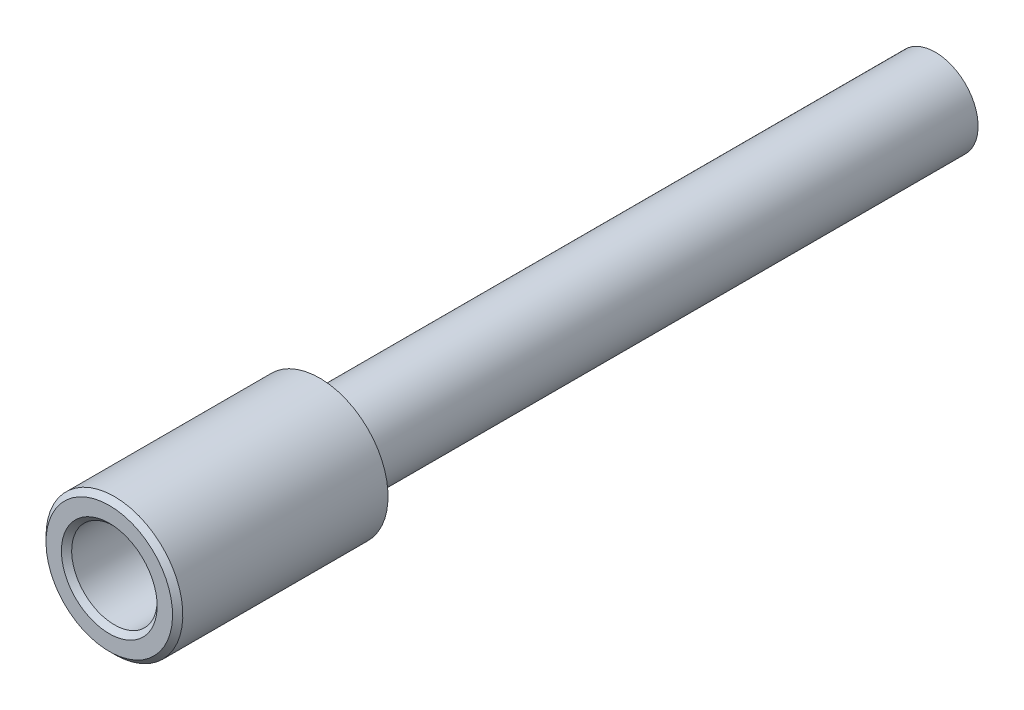
ISO-10303-21;
HEADER;
FILE_DESCRIPTION(('STEP AP214'),'2;1');
FILE_NAME('part.step','',(''),(''),'','','');
FILE_SCHEMA(('AUTOMOTIVE_DESIGN { 1 0 10303 214 1 1 1 1 }'));
ENDSEC;
DATA;
#1=APPLICATION_CONTEXT('core data for automotive mechanical design processes');
#2=APPLICATION_PROTOCOL_DEFINITION('international standard','automotive_design',2000,#1);
#3=PRODUCT_CONTEXT('',#1,'mechanical');
#4=PRODUCT('Part','Part','',(#3));
#5=PRODUCT_RELATED_PRODUCT_CATEGORY('part','',(#4));
#6=PRODUCT_DEFINITION_FORMATION('','',#4);
#7=PRODUCT_DEFINITION_CONTEXT('part definition',#1,'design');
#8=PRODUCT_DEFINITION('design','',#6,#7);
#9=PRODUCT_DEFINITION_SHAPE('','',#8);
#10=(LENGTH_UNIT() NAMED_UNIT(*) SI_UNIT(.MILLI.,.METRE.));
#11=(NAMED_UNIT(*) PLANE_ANGLE_UNIT() SI_UNIT($,.RADIAN.));
#12=(NAMED_UNIT(*) SI_UNIT($,.STERADIAN.) SOLID_ANGLE_UNIT());
#13=UNCERTAINTY_MEASURE_WITH_UNIT(LENGTH_MEASURE(1.E-05),#10,'distance_accuracy_value','');
#14=(GEOMETRIC_REPRESENTATION_CONTEXT(3) GLOBAL_UNCERTAINTY_ASSIGNED_CONTEXT((#13)) GLOBAL_UNIT_ASSIGNED_CONTEXT((#10,
#11,#12)) REPRESENTATION_CONTEXT('',''));
#15=CARTESIAN_POINT('',(0.,0.,0.));
#16=DIRECTION('',(0.,0.,1.));
#17=DIRECTION('',(1.,0.,0.));
#18=AXIS2_PLACEMENT_3D('',#15,#16,#17);
#19=CARTESIAN_POINT('',(0.,0.,0.));
#20=DIRECTION('',(0.,0.,1.));
#21=DIRECTION('',(1.,0.,0.));
#22=AXIS2_PLACEMENT_3D('',#19,#20,#21);
#23=CYLINDRICAL_SURFACE('',#22,2.5);
#24=CARTESIAN_POINT('',(0.,0.,36.));
#25=DIRECTION('',(0.,0.,1.));
#26=DIRECTION('',(1.,0.,0.));
#27=AXIS2_PLACEMENT_3D('',#24,#25,#26);
#28=CIRCLE('',#27,2.5);
#29=CARTESIAN_POINT('',(-2.5,0.,36.));
#30=VERTEX_POINT('',#29);
#31=EDGE_CURVE('E27',#30,#30,#28,.T.);
#32=ORIENTED_EDGE('',*,*,#31,.F.);
#33=DIRECTION('',(0.,0.,-1.));
#34=VECTOR('',#33,1.);
#35=CARTESIAN_POINT('',(-2.5,0.,0.));
#36=LINE('',#35,#34);
#37=CARTESIAN_POINT('',(-2.5,0.,0.));
#38=VERTEX_POINT('',#37);
#39=EDGE_CURVE('E11',#30,#38,#36,.T.);
#40=ORIENTED_EDGE('',*,*,#39,.T.);
#41=CARTESIAN_POINT('',(0.,0.,0.));
#42=DIRECTION('',(0.,0.,1.));
#43=DIRECTION('',(1.,0.,0.));
#44=AXIS2_PLACEMENT_3D('',#41,#42,#43);
#45=CIRCLE('',#44,2.5);
#46=EDGE_CURVE('E98',#38,#38,#45,.T.);
#47=ORIENTED_EDGE('',*,*,#46,.T.);
#48=ORIENTED_EDGE('',*,*,#39,.F.);
#49=EDGE_LOOP('',(#32,#40,#47,#48));
#50=FACE_BOUND('',#49,.T.);
#51=ADVANCED_FACE('F17',(#50),#23,.T.);
#52=CARTESIAN_POINT('',(0.,0.,36.));
#53=DIRECTION('',(0.,0.,1.));
#54=DIRECTION('',(1.,0.,0.));
#55=AXIS2_PLACEMENT_3D('',#52,#53,#54);
#56=PLANE('',#55);
#57=ORIENTED_EDGE('',*,*,#31,.T.);
#58=EDGE_LOOP('',(#57));
#59=FACE_BOUND('',#58,.T.);
#60=CARTESIAN_POINT('',(0.,0.,36.));
#61=DIRECTION('',(0.,0.,1.));
#62=DIRECTION('',(-1.,0.,0.));
#63=AXIS2_PLACEMENT_3D('',#60,#61,#62);
#64=CIRCLE('',#63,4.);
#65=CARTESIAN_POINT('',(-4.,0.,36.));
#66=VERTEX_POINT('',#65);
#67=EDGE_CURVE('E105',#66,#66,#64,.T.);
#68=ORIENTED_EDGE('',*,*,#67,.F.);
#69=EDGE_LOOP('',(#68));
#70=FACE_BOUND('',#69,.T.);
#71=ADVANCED_FACE('F154',(#59,#70),#56,.F.);
#72=CARTESIAN_POINT('',(0.,0.,36.));
#73=DIRECTION('',(0.,0.,1.));
#74=DIRECTION('',(1.,0.,0.));
#75=AXIS2_PLACEMENT_3D('',#72,#73,#74);
#76=CYLINDRICAL_SURFACE('',#75,4.);
#77=CARTESIAN_POINT('',(0.,0.,48.));
#78=DIRECTION('',(0.,0.,1.));
#79=DIRECTION('',(1.,0.,0.));
#80=AXIS2_PLACEMENT_3D('',#77,#78,#79);
#81=CIRCLE('',#80,4.);
#82=CARTESIAN_POINT('',(-4.,0.,48.));
#83=VERTEX_POINT('',#82);
#84=CARTESIAN_POINT('',(0.,4.0000000000005,48.));
#85=VERTEX_POINT('',#84);
#86=EDGE_CURVE('E121',#83,#85,#81,.T.);
#87=ORIENTED_EDGE('',*,*,#86,.F.);
#88=DIRECTION('',(0.,0.,-1.));
#89=VECTOR('',#88,1.);
#90=CARTESIAN_POINT('',(-4.,0.,36.));
#91=LINE('',#90,#89);
#92=EDGE_CURVE('E101',#83,#66,#91,.T.);
#93=ORIENTED_EDGE('',*,*,#92,.T.);
#94=ORIENTED_EDGE('',*,*,#67,.T.);
#95=ORIENTED_EDGE('',*,*,#92,.F.);
#96=CARTESIAN_POINT('',(0.,0.,48.));
#97=DIRECTION('',(0.,0.,1.));
#98=DIRECTION('',(1.,0.,0.));
#99=AXIS2_PLACEMENT_3D('',#96,#97,#98);
#100=CIRCLE('',#99,4.);
#101=EDGE_CURVE('E106',#85,#83,#100,.T.);
#102=ORIENTED_EDGE('',*,*,#101,.F.);
#103=EDGE_LOOP('',(#87,#93,#94,#95,#102));
#104=FACE_BOUND('',#103,.T.);
#105=ADVANCED_FACE('F151',(#104),#76,.T.);
#106=CARTESIAN_POINT('',(0.,0.,48.15000000062));
#107=DIRECTION('',(0.,0.,-1.));
#108=DIRECTION('',(0.,-1.,0.));
#109=AXIS2_PLACEMENT_3D('',#106,#107,#108);
#110=CONICAL_SURFACE('',#109,3.849999999381,0.785398163397448);
#111=ORIENTED_EDGE('',*,*,#86,.T.);
#112=DIRECTION('',(0.,-0.707106781186548,0.707106781186548));
#113=VECTOR('',#112,1.);
#114=CARTESIAN_POINT('',(0.,3.849999999381,48.15000000062));
#115=LINE('',#114,#113);
#116=CARTESIAN_POINT('',(0.,3.7000000000005,48.3));
#117=VERTEX_POINT('',#116);
#118=EDGE_CURVE('E124',#85,#117,#115,.T.);
#119=ORIENTED_EDGE('',*,*,#118,.T.);
#120=CARTESIAN_POINT('',(0.,0.,48.3));
#121=DIRECTION('',(0.,0.,1.));
#122=DIRECTION('',(1.,0.,0.));
#123=AXIS2_PLACEMENT_3D('',#120,#121,#122);
#124=CIRCLE('',#123,3.7);
#125=EDGE_CURVE('E120',#117,#117,#124,.T.);
#126=ORIENTED_EDGE('',*,*,#125,.F.);
#127=ORIENTED_EDGE('',*,*,#118,.F.);
#128=ORIENTED_EDGE('',*,*,#101,.T.);
#129=EDGE_LOOP('',(#111,#119,#126,#127,#128));
#130=FACE_BOUND('',#129,.T.);
#131=ADVANCED_FACE('F148',(#130),#110,.T.);
#132=CARTESIAN_POINT('',(0.,0.,48.3));
#133=DIRECTION('',(0.,0.,1.));
#134=DIRECTION('',(1.,0.,0.));
#135=AXIS2_PLACEMENT_3D('',#132,#133,#134);
#136=PLANE('',#135);
#137=CARTESIAN_POINT('',(0.,0.,48.3));
#138=DIRECTION('',(0.,0.,-1.));
#139=DIRECTION('',(-1.,0.,0.));
#140=AXIS2_PLACEMENT_3D('',#137,#138,#139);
#141=CIRCLE('',#140,2.8);
#142=CARTESIAN_POINT('',(0.,2.8000000000005,48.3));
#143=VERTEX_POINT('',#142);
#144=EDGE_CURVE('E117',#143,#143,#141,.T.);
#145=ORIENTED_EDGE('',*,*,#144,.T.);
#146=EDGE_LOOP('',(#145));
#147=FACE_BOUND('',#146,.T.);
#148=ORIENTED_EDGE('',*,*,#125,.T.);
#149=EDGE_LOOP('',(#148));
#150=FACE_BOUND('',#149,.T.);
#151=ADVANCED_FACE('F145',(#147,#150),#136,.T.);
#152=CARTESIAN_POINT('',(0.,0.,48.14999999688));
#153=DIRECTION('',(0.,0.,1.));
#154=DIRECTION('',(0.,-1.,0.));
#155=AXIS2_PLACEMENT_3D('',#152,#153,#154);
#156=CONICAL_SURFACE('',#155,2.649999996881,0.785398163397448);
#157=CARTESIAN_POINT('',(0.,0.,48.));
#158=DIRECTION('',(0.,0.,-1.));
#159=DIRECTION('',(-1.,0.,0.));
#160=AXIS2_PLACEMENT_3D('',#157,#158,#159);
#161=CIRCLE('',#160,2.5);
#162=CARTESIAN_POINT('',(2.5,0.,48.));
#163=VERTEX_POINT('',#162);
#164=CARTESIAN_POINT('',(0.,2.5000000000005,48.));
#165=VERTEX_POINT('',#164);
#166=EDGE_CURVE('E116',#163,#165,#161,.T.);
#167=ORIENTED_EDGE('',*,*,#166,.T.);
#168=DIRECTION('',(0.,0.707106781186548,0.707106781186548));
#169=VECTOR('',#168,1.);
#170=CARTESIAN_POINT('',(0.,2.649999996881,48.14999999688));
#171=LINE('',#170,#169);
#172=EDGE_CURVE('E20',#165,#143,#171,.T.);
#173=ORIENTED_EDGE('',*,*,#172,.T.);
#174=ORIENTED_EDGE('',*,*,#144,.F.);
#175=ORIENTED_EDGE('',*,*,#172,.F.);
#176=CARTESIAN_POINT('',(0.,0.,48.));
#177=DIRECTION('',(0.,0.,-1.));
#178=DIRECTION('',(-1.,0.,0.));
#179=AXIS2_PLACEMENT_3D('',#176,#177,#178);
#180=CIRCLE('',#179,2.5);
#181=EDGE_CURVE('E130',#165,#163,#180,.T.);
#182=ORIENTED_EDGE('',*,*,#181,.T.);
#183=EDGE_LOOP('',(#167,#173,#174,#175,#182));
#184=FACE_BOUND('',#183,.T.);
#185=ADVANCED_FACE('F167',(#184),#156,.F.);
#186=CARTESIAN_POINT('',(0.,0.,48.3));
#187=DIRECTION('',(0.,0.,-1.));
#188=DIRECTION('',(-1.,0.,0.));
#189=AXIS2_PLACEMENT_3D('',#186,#187,#188);
#190=CYLINDRICAL_SURFACE('',#189,2.5);
#191=ORIENTED_EDGE('',*,*,#166,.F.);
#192=DIRECTION('',(0.,0.,-1.));
#193=VECTOR('',#192,1.);
#194=CARTESIAN_POINT('',(2.5,0.,48.3));
#195=LINE('',#194,#193);
#196=CARTESIAN_POINT('',(2.5,0.,41.3));
#197=VERTEX_POINT('',#196);
#198=EDGE_CURVE('E129',#163,#197,#195,.T.);
#199=ORIENTED_EDGE('',*,*,#198,.T.);
#200=CARTESIAN_POINT('',(0.,0.,41.3));
#201=DIRECTION('',(0.,0.,-1.));
#202=DIRECTION('',(-1.,0.,0.));
#203=AXIS2_PLACEMENT_3D('',#200,#201,#202);
#204=CIRCLE('',#203,2.5);
#205=EDGE_CURVE('E96',#197,#197,#204,.T.);
#206=ORIENTED_EDGE('',*,*,#205,.T.);
#207=ORIENTED_EDGE('',*,*,#198,.F.);
#208=ORIENTED_EDGE('',*,*,#181,.F.);
#209=EDGE_LOOP('',(#191,#199,#206,#207,#208));
#210=FACE_BOUND('',#209,.T.);
#211=ADVANCED_FACE('F169',(#210),#190,.F.);
#212=CARTESIAN_POINT('',(0.,0.,41.3));
#213=DIRECTION('',(0.,0.,-1.));
#214=DIRECTION('',(0.,-1.,0.));
#215=AXIS2_PLACEMENT_3D('',#212,#213,#214);
#216=PLANE('',#215);
#217=CARTESIAN_POINT('',(0.,0.,41.3));
#218=DIRECTION('',(0.,0.,1.));
#219=DIRECTION('',(-1.,0.,0.));
#220=AXIS2_PLACEMENT_3D('',#217,#218,#219);
#221=CIRCLE('',#220,2.);
#222=CARTESIAN_POINT('',(-2.,0.,41.3));
#223=VERTEX_POINT('',#222);
#224=EDGE_CURVE('E88',#223,#223,#221,.T.);
#225=ORIENTED_EDGE('',*,*,#224,.F.);
#226=EDGE_LOOP('',(#225));
#227=FACE_BOUND('',#226,.T.);
#228=ORIENTED_EDGE('',*,*,#205,.F.);
#229=EDGE_LOOP('',(#228));
#230=FACE_BOUND('',#229,.T.);
#231=ADVANCED_FACE('F175',(#227,#230),#216,.F.);
#232=CARTESIAN_POINT('',(0.,0.,0.));
#233=DIRECTION('',(0.,0.,1.));
#234=DIRECTION('',(1.,0.,0.));
#235=AXIS2_PLACEMENT_3D('',#232,#233,#234);
#236=CYLINDRICAL_SURFACE('',#235,2.);
#237=CARTESIAN_POINT('',(0.,0.,0.));
#238=DIRECTION('',(0.,0.,-1.));
#239=DIRECTION('',(1.,0.,0.));
#240=AXIS2_PLACEMENT_3D('',#237,#238,#239);
#241=CIRCLE('',#240,2.);
#242=CARTESIAN_POINT('',(-2.,0.,0.));
#243=VERTEX_POINT('',#242);
#244=EDGE_CURVE('E86',#243,#243,#241,.T.);
#245=ORIENTED_EDGE('',*,*,#244,.T.);
#246=DIRECTION('',(0.,0.,1.));
#247=VECTOR('',#246,1.);
#248=CARTESIAN_POINT('',(-2.,0.,0.));
#249=LINE('',#248,#247);
#250=EDGE_CURVE('E83',#243,#223,#249,.T.);
#251=ORIENTED_EDGE('',*,*,#250,.T.);
#252=ORIENTED_EDGE('',*,*,#224,.T.);
#253=ORIENTED_EDGE('',*,*,#250,.F.);
#254=EDGE_LOOP('',(#245,#251,#252,#253));
#255=FACE_BOUND('',#254,.T.);
#256=ADVANCED_FACE('F84',(#255),#236,.F.);
#257=CARTESIAN_POINT('',(0.,0.,0.));
#258=DIRECTION('',(0.,0.,1.));
#259=DIRECTION('',(1.,0.,0.));
#260=AXIS2_PLACEMENT_3D('',#257,#258,#259);
#261=PLANE('',#260);
#262=ORIENTED_EDGE('',*,*,#244,.F.);
#263=EDGE_LOOP('',(#262));
#264=FACE_BOUND('',#263,.T.);
#265=ORIENTED_EDGE('',*,*,#46,.F.);
#266=EDGE_LOOP('',(#265));
#267=FACE_BOUND('',#266,.T.);
#268=ADVANCED_FACE('F165',(#264,#267),#261,.F.);
#269=CLOSED_SHELL('',(#51,#71,#105,#131,#151,#185,#211,#231,#256,#268));
#270=MANIFOLD_SOLID_BREP('B1',#269);
#271=ADVANCED_BREP_SHAPE_REPRESENTATION('',(#18,#270),#14);
#272=SHAPE_DEFINITION_REPRESENTATION(#9,#271);
ENDSEC;
END-ISO-10303-21;
